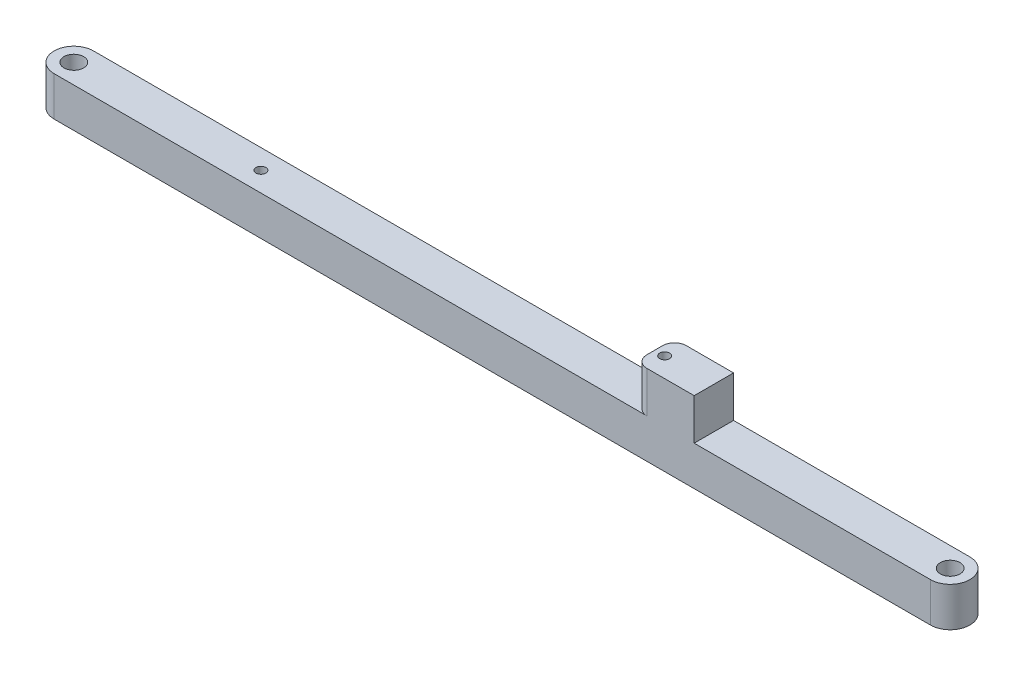
ISO-10303-21;
HEADER;
FILE_DESCRIPTION(('STEP AP214'),'2;1');
FILE_NAME('part.step','',(''),(''),'','','');
FILE_SCHEMA(('AUTOMOTIVE_DESIGN { 1 0 10303 214 1 1 1 1 }'));
ENDSEC;
DATA;
#1=APPLICATION_CONTEXT('core data for automotive mechanical design processes');
#2=APPLICATION_PROTOCOL_DEFINITION('international standard','automotive_design',2000,#1);
#3=PRODUCT_CONTEXT('',#1,'mechanical');
#4=PRODUCT('Part','Part','',(#3));
#5=PRODUCT_RELATED_PRODUCT_CATEGORY('part','',(#4));
#6=PRODUCT_DEFINITION_FORMATION('','',#4);
#7=PRODUCT_DEFINITION_CONTEXT('part definition',#1,'design');
#8=PRODUCT_DEFINITION('design','',#6,#7);
#9=PRODUCT_DEFINITION_SHAPE('','',#8);
#10=(LENGTH_UNIT() NAMED_UNIT(*) SI_UNIT(.MILLI.,.METRE.));
#11=(NAMED_UNIT(*) PLANE_ANGLE_UNIT() SI_UNIT($,.RADIAN.));
#12=(NAMED_UNIT(*) SI_UNIT($,.STERADIAN.) SOLID_ANGLE_UNIT());
#13=UNCERTAINTY_MEASURE_WITH_UNIT(LENGTH_MEASURE(1.E-05),#10,'distance_accuracy_value','');
#14=(GEOMETRIC_REPRESENTATION_CONTEXT(3) GLOBAL_UNCERTAINTY_ASSIGNED_CONTEXT((#13)) GLOBAL_UNIT_ASSIGNED_CONTEXT((#10,
#11,#12)) REPRESENTATION_CONTEXT('',''));
#15=CARTESIAN_POINT('',(0.,0.,0.));
#16=DIRECTION('',(0.,0.,1.));
#17=DIRECTION('',(1.,0.,0.));
#18=AXIS2_PLACEMENT_3D('',#15,#16,#17);
#19=CARTESIAN_POINT('',(0.,25.4,0.));
#20=DIRECTION('',(0.,1.,0.));
#21=DIRECTION('',(0.,0.,1.));
#22=AXIS2_PLACEMENT_3D('',#19,#20,#21);
#23=PLANE('',#22);
#24=DIRECTION('',(0.,0.,1.));
#25=VECTOR('',#24,1.);
#26=CARTESIAN_POINT('',(374.65,25.4,0.));
#27=LINE('',#26,#25);
#28=CARTESIAN_POINT('',(374.65,25.4,-17.78));
#29=VERTEX_POINT('',#28);
#30=CARTESIAN_POINT('',(374.65,25.4,-7.62));
#31=VERTEX_POINT('',#30);
#32=EDGE_CURVE('E150',#29,#31,#27,.T.);
#33=ORIENTED_EDGE('',*,*,#32,.F.);
#34=CARTESIAN_POINT('',(382.27,25.4,-17.78));
#35=DIRECTION('',(0.,1.,0.));
#36=DIRECTION('',(0.,0.,1.));
#37=AXIS2_PLACEMENT_3D('',#34,#35,#36);
#38=CIRCLE('',#37,7.62);
#39=CARTESIAN_POINT('',(382.27,25.4,-25.4));
#40=VERTEX_POINT('',#39);
#41=EDGE_CURVE('E11',#29,#40,#38,.F.);
#42=ORIENTED_EDGE('',*,*,#41,.T.);
#43=DIRECTION('',(1.,0.,0.));
#44=VECTOR('',#43,1.);
#45=CARTESIAN_POINT('',(0.,25.4,-25.4));
#46=LINE('',#45,#44);
#47=CARTESIAN_POINT('',(0.,25.4,-25.4));
#48=VERTEX_POINT('',#47);
#49=EDGE_CURVE('E53',#48,#40,#46,.T.);
#50=ORIENTED_EDGE('',*,*,#49,.F.);
#51=CARTESIAN_POINT('',(0.,25.4,-12.7));
#52=DIRECTION('',(0.,1.,0.));
#53=DIRECTION('',(0.,0.,1.));
#54=AXIS2_PLACEMENT_3D('',#51,#52,#53);
#55=CIRCLE('',#54,12.7);
#56=CARTESIAN_POINT('',(0.,25.4,0.));
#57=VERTEX_POINT('',#56);
#58=EDGE_CURVE('E193',#48,#57,#55,.T.);
#59=ORIENTED_EDGE('',*,*,#58,.T.);
#60=DIRECTION('',(1.,0.,0.));
#61=VECTOR('',#60,1.);
#62=CARTESIAN_POINT('',(0.,25.4,0.));
#63=LINE('',#62,#61);
#64=CARTESIAN_POINT('',(382.27,25.4,0.));
#65=VERTEX_POINT('',#64);
#66=EDGE_CURVE('E171',#57,#65,#63,.T.);
#67=ORIENTED_EDGE('',*,*,#66,.T.);
#68=CARTESIAN_POINT('',(382.27,25.4,-7.62));
#69=DIRECTION('',(0.,1.,0.));
#70=DIRECTION('',(0.,0.,1.));
#71=AXIS2_PLACEMENT_3D('',#68,#69,#70);
#72=CIRCLE('',#71,7.62);
#73=EDGE_CURVE('E46',#65,#31,#72,.F.);
#74=ORIENTED_EDGE('',*,*,#73,.T.);
#75=EDGE_LOOP('',(#33,#42,#50,#59,#67,#74));
#76=FACE_BOUND('',#75,.T.);
#77=CARTESIAN_POINT('',(120.65,25.4,-12.7));
#78=DIRECTION('',(0.,1.,0.));
#79=DIRECTION('',(0.,0.,1.));
#80=AXIS2_PLACEMENT_3D('',#77,#78,#79);
#81=CIRCLE('',#80,3.175);
#82=CARTESIAN_POINT('',(120.65,25.4,-9.525));
#83=VERTEX_POINT('',#82);
#84=EDGE_CURVE('E209',#83,#83,#81,.T.);
#85=ORIENTED_EDGE('',*,*,#84,.F.);
#86=EDGE_LOOP('',(#85));
#87=FACE_BOUND('',#86,.T.);
#88=CARTESIAN_POINT('',(0.,25.4,-12.7));
#89=DIRECTION('',(0.,1.,0.));
#90=DIRECTION('',(0.,0.,1.));
#91=AXIS2_PLACEMENT_3D('',#88,#89,#90);
#92=CIRCLE('',#91,6.35);
#93=CARTESIAN_POINT('',(0.,25.4,-6.35));
#94=VERTEX_POINT('',#93);
#95=EDGE_CURVE('E198',#94,#94,#92,.T.);
#96=ORIENTED_EDGE('',*,*,#95,.F.);
#97=EDGE_LOOP('',(#96));
#98=FACE_BOUND('',#97,.T.);
#99=ADVANCED_FACE('F38',(#76,#87,#98),#23,.T.);
#100=CARTESIAN_POINT('',(0.,25.4,-25.4));
#101=DIRECTION('',(0.,0.,-1.));
#102=DIRECTION('',(-1.,0.,0.));
#103=AXIS2_PLACEMENT_3D('',#100,#101,#102);
#104=PLANE('',#103);
#105=ORIENTED_EDGE('',*,*,#49,.T.);
#106=DIRECTION('',(0.,-1.,0.));
#107=VECTOR('',#106,1.);
#108=CARTESIAN_POINT('',(382.27,51.943,-25.4));
#109=LINE('',#108,#107);
#110=CARTESIAN_POINT('',(382.27,51.943,-25.4));
#111=VERTEX_POINT('',#110);
#112=EDGE_CURVE('E57',#40,#111,#109,.F.);
#113=ORIENTED_EDGE('',*,*,#112,.T.);
#114=DIRECTION('',(-1.,0.,0.));
#115=VECTOR('',#114,1.);
#116=CARTESIAN_POINT('',(374.65,51.943,-25.4));
#117=LINE('',#116,#115);
#118=CARTESIAN_POINT('',(412.75,51.943,-25.4));
#119=VERTEX_POINT('',#118);
#120=EDGE_CURVE('E140',#119,#111,#117,.T.);
#121=ORIENTED_EDGE('',*,*,#120,.F.);
#122=DIRECTION('',(0.,-1.,0.));
#123=VECTOR('',#122,1.);
#124=CARTESIAN_POINT('',(412.75,51.943,-25.4));
#125=LINE('',#124,#123);
#126=CARTESIAN_POINT('',(412.75,25.4,-25.4));
#127=VERTEX_POINT('',#126);
#128=EDGE_CURVE('E136',#119,#127,#125,.T.);
#129=ORIENTED_EDGE('',*,*,#128,.T.);
#130=CARTESIAN_POINT('',(565.15,25.4,-25.4));
#131=VERTEX_POINT('',#130);
#132=EDGE_CURVE('E194',#127,#131,#46,.T.);
#133=ORIENTED_EDGE('',*,*,#132,.T.);
#134=DIRECTION('',(0.,-1.,0.));
#135=VECTOR('',#134,1.);
#136=CARTESIAN_POINT('',(565.15,25.4,-25.4));
#137=LINE('',#136,#135);
#138=CARTESIAN_POINT('',(565.15,0.,-25.4));
#139=VERTEX_POINT('',#138);
#140=EDGE_CURVE('E219',#131,#139,#137,.T.);
#141=ORIENTED_EDGE('',*,*,#140,.T.);
#142=DIRECTION('',(1.,0.,0.));
#143=VECTOR('',#142,1.);
#144=CARTESIAN_POINT('',(0.,0.,-25.4));
#145=LINE('',#144,#143);
#146=CARTESIAN_POINT('',(0.,0.,-25.4));
#147=VERTEX_POINT('',#146);
#148=EDGE_CURVE('E240',#147,#139,#145,.T.);
#149=ORIENTED_EDGE('',*,*,#148,.F.);
#150=DIRECTION('',(0.,-1.,0.));
#151=VECTOR('',#150,1.);
#152=CARTESIAN_POINT('',(0.,25.4,-25.4));
#153=LINE('',#152,#151);
#154=EDGE_CURVE('E179',#48,#147,#153,.T.);
#155=ORIENTED_EDGE('',*,*,#154,.F.);
#156=EDGE_LOOP('',(#105,#113,#121,#129,#133,#141,#149,#155));
#157=FACE_BOUND('',#156,.T.);
#158=ADVANCED_FACE('F250',(#157),#104,.T.);
#159=CARTESIAN_POINT('',(0.,25.4,-12.7));
#160=DIRECTION('',(0.,-1.,0.));
#161=DIRECTION('',(0.,0.,-1.));
#162=AXIS2_PLACEMENT_3D('',#159,#160,#161);
#163=CYLINDRICAL_SURFACE('',#162,12.7);
#164=CARTESIAN_POINT('',(0.,0.,-12.7));
#165=DIRECTION('',(0.,1.,0.));
#166=DIRECTION('',(0.,0.,1.));
#167=AXIS2_PLACEMENT_3D('',#164,#165,#166);
#168=CIRCLE('',#167,12.7);
#169=CARTESIAN_POINT('',(0.,0.,0.));
#170=VERTEX_POINT('',#169);
#171=EDGE_CURVE('E238',#147,#170,#168,.T.);
#172=ORIENTED_EDGE('',*,*,#171,.T.);
#173=DIRECTION('',(0.,-1.,0.));
#174=VECTOR('',#173,1.);
#175=CARTESIAN_POINT('',(0.,25.4,0.));
#176=LINE('',#175,#174);
#177=EDGE_CURVE('E180',#57,#170,#176,.T.);
#178=ORIENTED_EDGE('',*,*,#177,.F.);
#179=ORIENTED_EDGE('',*,*,#58,.F.);
#180=ORIENTED_EDGE('',*,*,#154,.T.);
#181=EDGE_LOOP('',(#172,#178,#179,#180));
#182=FACE_BOUND('',#181,.T.);
#183=ADVANCED_FACE('F300',(#182),#163,.T.);
#184=CARTESIAN_POINT('',(0.,25.4,0.));
#185=DIRECTION('',(0.,0.,-1.));
#186=DIRECTION('',(-1.,0.,0.));
#187=AXIS2_PLACEMENT_3D('',#184,#185,#186);
#188=PLANE('',#187);
#189=DIRECTION('',(1.,0.,0.));
#190=VECTOR('',#189,1.);
#191=CARTESIAN_POINT('',(374.65,51.943,0.));
#192=LINE('',#191,#190);
#193=CARTESIAN_POINT('',(382.27,51.943,0.));
#194=VERTEX_POINT('',#193);
#195=CARTESIAN_POINT('',(412.75,51.943,0.));
#196=VERTEX_POINT('',#195);
#197=EDGE_CURVE('E113',#194,#196,#192,.T.);
#198=ORIENTED_EDGE('',*,*,#197,.F.);
#199=DIRECTION('',(0.,-1.,0.));
#200=VECTOR('',#199,1.);
#201=CARTESIAN_POINT('',(382.27,25.4,0.));
#202=LINE('',#201,#200);
#203=EDGE_CURVE('E156',#194,#65,#202,.T.);
#204=ORIENTED_EDGE('',*,*,#203,.T.);
#205=ORIENTED_EDGE('',*,*,#66,.F.);
#206=ORIENTED_EDGE('',*,*,#177,.T.);
#207=DIRECTION('',(1.,0.,0.));
#208=VECTOR('',#207,1.);
#209=CARTESIAN_POINT('',(0.,0.,0.));
#210=LINE('',#209,#208);
#211=CARTESIAN_POINT('',(565.15,0.,0.));
#212=VERTEX_POINT('',#211);
#213=EDGE_CURVE('E215',#170,#212,#210,.T.);
#214=ORIENTED_EDGE('',*,*,#213,.T.);
#215=DIRECTION('',(0.,-1.,0.));
#216=VECTOR('',#215,1.);
#217=CARTESIAN_POINT('',(565.15,25.4,0.));
#218=LINE('',#217,#216);
#219=CARTESIAN_POINT('',(565.15,25.4,0.));
#220=VERTEX_POINT('',#219);
#221=EDGE_CURVE('E187',#220,#212,#218,.T.);
#222=ORIENTED_EDGE('',*,*,#221,.F.);
#223=CARTESIAN_POINT('',(412.75,25.4,0.));
#224=VERTEX_POINT('',#223);
#225=EDGE_CURVE('E132',#224,#220,#63,.T.);
#226=ORIENTED_EDGE('',*,*,#225,.F.);
#227=DIRECTION('',(0.,-1.,0.));
#228=VECTOR('',#227,1.);
#229=CARTESIAN_POINT('',(412.75,51.943,0.));
#230=LINE('',#229,#228);
#231=EDGE_CURVE('E129',#196,#224,#230,.T.);
#232=ORIENTED_EDGE('',*,*,#231,.F.);
#233=EDGE_LOOP('',(#198,#204,#205,#206,#214,#222,#226,#232));
#234=FACE_BOUND('',#233,.T.);
#235=ADVANCED_FACE('F130',(#234),#188,.F.);
#236=CARTESIAN_POINT('',(120.65,25.4,-12.7));
#237=DIRECTION('',(0.,-1.,0.));
#238=DIRECTION('',(0.,0.,-1.));
#239=AXIS2_PLACEMENT_3D('',#236,#237,#238);
#240=CYLINDRICAL_SURFACE('',#239,3.175);
#241=ORIENTED_EDGE('',*,*,#84,.T.);
#242=EDGE_LOOP('',(#241));
#243=FACE_BOUND('',#242,.T.);
#244=CARTESIAN_POINT('',(120.65,0.,-12.7));
#245=DIRECTION('',(0.,1.,0.));
#246=DIRECTION('',(0.,0.,1.));
#247=AXIS2_PLACEMENT_3D('',#244,#245,#246);
#248=CIRCLE('',#247,3.175);
#249=CARTESIAN_POINT('',(120.65,0.,-9.525));
#250=VERTEX_POINT('',#249);
#251=EDGE_CURVE('E233',#250,#250,#248,.T.);
#252=ORIENTED_EDGE('',*,*,#251,.F.);
#253=EDGE_LOOP('',(#252));
#254=FACE_BOUND('',#253,.T.);
#255=ADVANCED_FACE('F246',(#243,#254),#240,.F.);
#256=CARTESIAN_POINT('',(565.15,25.4,-12.7));
#257=DIRECTION('',(0.,-1.,0.));
#258=DIRECTION('',(0.,0.,-1.));
#259=AXIS2_PLACEMENT_3D('',#256,#257,#258);
#260=CYLINDRICAL_SURFACE('',#259,12.7);
#261=CARTESIAN_POINT('',(565.15,0.,-12.7));
#262=DIRECTION('',(0.,1.,0.));
#263=DIRECTION('',(0.,0.,1.));
#264=AXIS2_PLACEMENT_3D('',#261,#262,#263);
#265=CIRCLE('',#264,12.7);
#266=EDGE_CURVE('E222',#139,#212,#265,.F.);
#267=ORIENTED_EDGE('',*,*,#266,.F.);
#268=ORIENTED_EDGE('',*,*,#140,.F.);
#269=CARTESIAN_POINT('',(565.15,25.4,-12.7));
#270=DIRECTION('',(0.,1.,0.));
#271=DIRECTION('',(0.,0.,1.));
#272=AXIS2_PLACEMENT_3D('',#269,#270,#271);
#273=CIRCLE('',#272,12.7);
#274=EDGE_CURVE('E203',#131,#220,#273,.F.);
#275=ORIENTED_EDGE('',*,*,#274,.T.);
#276=ORIENTED_EDGE('',*,*,#221,.T.);
#277=EDGE_LOOP('',(#267,#268,#275,#276));
#278=FACE_BOUND('',#277,.T.);
#279=ADVANCED_FACE('F221',(#278),#260,.T.);
#280=CARTESIAN_POINT('',(0.,25.4,-12.7));
#281=DIRECTION('',(0.,-1.,0.));
#282=DIRECTION('',(0.,0.,-1.));
#283=AXIS2_PLACEMENT_3D('',#280,#281,#282);
#284=CYLINDRICAL_SURFACE('',#283,6.35);
#285=ORIENTED_EDGE('',*,*,#95,.T.);
#286=EDGE_LOOP('',(#285));
#287=FACE_BOUND('',#286,.T.);
#288=CARTESIAN_POINT('',(0.,0.,-12.7));
#289=DIRECTION('',(0.,1.,0.));
#290=DIRECTION('',(0.,0.,1.));
#291=AXIS2_PLACEMENT_3D('',#288,#289,#290);
#292=CIRCLE('',#291,6.35);
#293=CARTESIAN_POINT('',(0.,0.,-6.35));
#294=VERTEX_POINT('',#293);
#295=EDGE_CURVE('E135',#294,#294,#292,.T.);
#296=ORIENTED_EDGE('',*,*,#295,.F.);
#297=EDGE_LOOP('',(#296));
#298=FACE_BOUND('',#297,.T.);
#299=ADVANCED_FACE('F292',(#287,#298),#284,.F.);
#300=CARTESIAN_POINT('',(565.15,25.4,-12.7));
#301=DIRECTION('',(0.,-1.,0.));
#302=DIRECTION('',(0.,0.,-1.));
#303=AXIS2_PLACEMENT_3D('',#300,#301,#302);
#304=CYLINDRICAL_SURFACE('',#303,6.34999999999994);
#305=CARTESIAN_POINT('',(565.15,25.4,-12.7));
#306=DIRECTION('',(0.,1.,0.));
#307=DIRECTION('',(0.,0.,1.));
#308=AXIS2_PLACEMENT_3D('',#305,#306,#307);
#309=CIRCLE('',#308,6.34999999999994);
#310=CARTESIAN_POINT('',(565.15,25.4,-6.35000000000006));
#311=VERTEX_POINT('',#310);
#312=EDGE_CURVE('E225',#311,#311,#309,.T.);
#313=ORIENTED_EDGE('',*,*,#312,.T.);
#314=EDGE_LOOP('',(#313));
#315=FACE_BOUND('',#314,.T.);
#316=CARTESIAN_POINT('',(565.15,0.,-12.7));
#317=DIRECTION('',(0.,1.,0.));
#318=DIRECTION('',(0.,0.,1.));
#319=AXIS2_PLACEMENT_3D('',#316,#317,#318);
#320=CIRCLE('',#319,6.34999999999994);
#321=CARTESIAN_POINT('',(565.15,0.,-6.35000000000006));
#322=VERTEX_POINT('',#321);
#323=EDGE_CURVE('E230',#322,#322,#320,.T.);
#324=ORIENTED_EDGE('',*,*,#323,.F.);
#325=EDGE_LOOP('',(#324));
#326=FACE_BOUND('',#325,.T.);
#327=ADVANCED_FACE('F286',(#315,#326),#304,.F.);
#328=DIRECTION('',(0.,0.,-1.));
#329=VECTOR('',#328,1.);
#330=CARTESIAN_POINT('',(412.75,25.4,0.));
#331=LINE('',#330,#329);
#332=EDGE_CURVE('E154',#224,#127,#331,.T.);
#333=ORIENTED_EDGE('',*,*,#332,.F.);
#334=ORIENTED_EDGE('',*,*,#225,.T.);
#335=ORIENTED_EDGE('',*,*,#274,.F.);
#336=ORIENTED_EDGE('',*,*,#132,.F.);
#337=EDGE_LOOP('',(#333,#334,#335,#336));
#338=FACE_BOUND('',#337,.T.);
#339=ORIENTED_EDGE('',*,*,#312,.F.);
#340=EDGE_LOOP('',(#339));
#341=FACE_BOUND('',#340,.T.);
#342=ADVANCED_FACE('F212',(#338,#341),#23,.T.);
#343=CARTESIAN_POINT('',(0.,0.,0.));
#344=DIRECTION('',(0.,1.,0.));
#345=DIRECTION('',(0.,0.,1.));
#346=AXIS2_PLACEMENT_3D('',#343,#344,#345);
#347=PLANE('',#346);
#348=ORIENTED_EDGE('',*,*,#295,.T.);
#349=EDGE_LOOP('',(#348));
#350=FACE_BOUND('',#349,.T.);
#351=ORIENTED_EDGE('',*,*,#148,.T.);
#352=ORIENTED_EDGE('',*,*,#266,.T.);
#353=ORIENTED_EDGE('',*,*,#213,.F.);
#354=ORIENTED_EDGE('',*,*,#171,.F.);
#355=EDGE_LOOP('',(#351,#352,#353,#354));
#356=FACE_BOUND('',#355,.T.);
#357=ORIENTED_EDGE('',*,*,#251,.T.);
#358=EDGE_LOOP('',(#357));
#359=FACE_BOUND('',#358,.T.);
#360=ORIENTED_EDGE('',*,*,#323,.T.);
#361=EDGE_LOOP('',(#360));
#362=FACE_BOUND('',#361,.T.);
#363=ADVANCED_FACE('F283',(#350,#356,#359,#362),#347,.F.);
#364=CARTESIAN_POINT('',(374.65,51.943,0.));
#365=DIRECTION('',(1.,0.,0.));
#366=DIRECTION('',(0.,0.,-1.));
#367=AXIS2_PLACEMENT_3D('',#364,#365,#366);
#368=PLANE('',#367);
#369=ORIENTED_EDGE('',*,*,#32,.T.);
#370=DIRECTION('',(0.,-1.,0.));
#371=VECTOR('',#370,1.);
#372=CARTESIAN_POINT('',(374.65,51.943,-7.62));
#373=LINE('',#372,#371);
#374=CARTESIAN_POINT('',(374.65,51.943,-7.62));
#375=VERTEX_POINT('',#374);
#376=EDGE_CURVE('E161',#31,#375,#373,.F.);
#377=ORIENTED_EDGE('',*,*,#376,.T.);
#378=DIRECTION('',(0.,0.,1.));
#379=VECTOR('',#378,1.);
#380=CARTESIAN_POINT('',(374.65,51.943,0.));
#381=LINE('',#380,#379);
#382=CARTESIAN_POINT('',(374.65,51.943,-17.78));
#383=VERTEX_POINT('',#382);
#384=EDGE_CURVE('E125',#383,#375,#381,.T.);
#385=ORIENTED_EDGE('',*,*,#384,.F.);
#386=DIRECTION('',(0.,-1.,0.));
#387=VECTOR('',#386,1.);
#388=CARTESIAN_POINT('',(374.65,25.4,-17.78));
#389=LINE('',#388,#387);
#390=EDGE_CURVE('E158',#383,#29,#389,.T.);
#391=ORIENTED_EDGE('',*,*,#390,.T.);
#392=EDGE_LOOP('',(#369,#377,#385,#391));
#393=FACE_BOUND('',#392,.T.);
#394=ADVANCED_FACE('F175',(#393),#368,.F.);
#395=CARTESIAN_POINT('',(412.75,51.943,0.));
#396=DIRECTION('',(-1.,0.,0.));
#397=DIRECTION('',(0.,0.,1.));
#398=AXIS2_PLACEMENT_3D('',#395,#396,#397);
#399=PLANE('',#398);
#400=ORIENTED_EDGE('',*,*,#332,.T.);
#401=ORIENTED_EDGE('',*,*,#128,.F.);
#402=DIRECTION('',(0.,0.,-1.));
#403=VECTOR('',#402,1.);
#404=CARTESIAN_POINT('',(412.75,51.943,0.));
#405=LINE('',#404,#403);
#406=EDGE_CURVE('E118',#196,#119,#405,.T.);
#407=ORIENTED_EDGE('',*,*,#406,.F.);
#408=ORIENTED_EDGE('',*,*,#231,.T.);
#409=EDGE_LOOP('',(#400,#401,#407,#408));
#410=FACE_BOUND('',#409,.T.);
#411=ADVANCED_FACE('F138',(#410),#399,.F.);
#412=CARTESIAN_POINT('',(0.,51.943,0.));
#413=DIRECTION('',(0.,-1.,0.));
#414=DIRECTION('',(0.,0.,-1.));
#415=AXIS2_PLACEMENT_3D('',#412,#413,#414);
#416=PLANE('',#415);
#417=CARTESIAN_POINT('',(381.,51.943,-12.7));
#418=DIRECTION('',(0.,1.,0.));
#419=DIRECTION('',(0.,0.,1.));
#420=AXIS2_PLACEMENT_3D('',#417,#418,#419);
#421=CIRCLE('',#420,3.17499999999997);
#422=CARTESIAN_POINT('',(381.,51.943,-9.52500000000002));
#423=VERTEX_POINT('',#422);
#424=EDGE_CURVE('E260',#423,#423,#421,.T.);
#425=ORIENTED_EDGE('',*,*,#424,.F.);
#426=EDGE_LOOP('',(#425));
#427=FACE_BOUND('',#426,.T.);
#428=ORIENTED_EDGE('',*,*,#384,.T.);
#429=CARTESIAN_POINT('',(382.27,51.943,-7.62));
#430=DIRECTION('',(0.,-1.,0.));
#431=DIRECTION('',(0.,0.,-1.));
#432=AXIS2_PLACEMENT_3D('',#429,#430,#431);
#433=CIRCLE('',#432,7.62);
#434=EDGE_CURVE('E121',#375,#194,#433,.F.);
#435=ORIENTED_EDGE('',*,*,#434,.T.);
#436=ORIENTED_EDGE('',*,*,#197,.T.);
#437=ORIENTED_EDGE('',*,*,#406,.T.);
#438=ORIENTED_EDGE('',*,*,#120,.T.);
#439=CARTESIAN_POINT('',(382.27,51.943,-17.78));
#440=DIRECTION('',(0.,-1.,0.));
#441=DIRECTION('',(0.,0.,-1.));
#442=AXIS2_PLACEMENT_3D('',#439,#440,#441);
#443=CIRCLE('',#442,7.62);
#444=EDGE_CURVE('E163',#111,#383,#443,.F.);
#445=ORIENTED_EDGE('',*,*,#444,.T.);
#446=EDGE_LOOP('',(#428,#435,#436,#437,#438,#445));
#447=FACE_BOUND('',#446,.T.);
#448=ADVANCED_FACE('F116',(#427,#447),#416,.F.);
#449=CARTESIAN_POINT('',(381.,32.893,-12.7));
#450=DIRECTION('',(0.,1.,0.));
#451=DIRECTION('',(0.,0.,1.));
#452=AXIS2_PLACEMENT_3D('',#449,#450,#451);
#453=CYLINDRICAL_SURFACE('',#452,3.17499999999997);
#454=CARTESIAN_POINT('',(381.,32.893,-12.7));
#455=DIRECTION('',(0.,1.,0.));
#456=DIRECTION('',(0.,0.,1.));
#457=AXIS2_PLACEMENT_3D('',#454,#455,#456);
#458=CIRCLE('',#457,3.17499999999997);
#459=CARTESIAN_POINT('',(381.,32.893,-9.52500000000002));
#460=VERTEX_POINT('',#459);
#461=EDGE_CURVE('E155',#460,#460,#458,.T.);
#462=CARTESIAN_POINT('',(381.,32.893,-9.52500000000002));
#463=CARTESIAN_POINT('',(381.,33.0914375,-9.52500000000002));
#464=CARTESIAN_POINT('',(381.,33.289875,-9.52500000000002));
#465=CARTESIAN_POINT('',(381.,33.68675,-9.52500000000002));
#466=CARTESIAN_POINT('',(381.,33.8851875,-9.52500000000002));
#467=CARTESIAN_POINT('',(381.,34.2820625,-9.52500000000002));
#468=CARTESIAN_POINT('',(381.,34.4805,-9.52500000000002));
#469=CARTESIAN_POINT('',(381.,34.877375,-9.52500000000002));
#470=CARTESIAN_POINT('',(381.,35.0758125,-9.52500000000002));
#471=CARTESIAN_POINT('',(381.,35.4726875,-9.52500000000002));
#472=CARTESIAN_POINT('',(381.,35.671125,-9.52500000000002));
#473=CARTESIAN_POINT('',(381.,36.068,-9.52500000000002));
#474=CARTESIAN_POINT('',(381.,36.2664375,-9.52500000000002));
#475=CARTESIAN_POINT('',(381.,36.6633125,-9.52500000000002));
#476=CARTESIAN_POINT('',(381.,36.86175,-9.52500000000002));
#477=CARTESIAN_POINT('',(381.,37.258625,-9.52500000000002));
#478=CARTESIAN_POINT('',(381.,37.4570625,-9.52500000000002));
#479=CARTESIAN_POINT('',(381.,37.8539375,-9.52500000000002));
#480=CARTESIAN_POINT('',(381.,38.052375,-9.52500000000002));
#481=CARTESIAN_POINT('',(381.,38.44925,-9.52500000000002));
#482=CARTESIAN_POINT('',(381.,38.6476875,-9.52500000000002));
#483=CARTESIAN_POINT('',(381.,39.0445625,-9.52500000000002));
#484=CARTESIAN_POINT('',(381.,39.243,-9.52500000000002));
#485=CARTESIAN_POINT('',(381.,39.639875,-9.52500000000002));
#486=CARTESIAN_POINT('',(381.,39.8383125,-9.52500000000002));
#487=CARTESIAN_POINT('',(381.,40.2351875,-9.52500000000002));
#488=CARTESIAN_POINT('',(381.,40.433625,-9.52500000000002));
#489=CARTESIAN_POINT('',(381.,40.8305,-9.52500000000002));
#490=CARTESIAN_POINT('',(381.,41.0289375,-9.52500000000002));
#491=CARTESIAN_POINT('',(381.,41.4258125,-9.52500000000002));
#492=CARTESIAN_POINT('',(381.,41.62425,-9.52500000000002));
#493=CARTESIAN_POINT('',(381.,42.021125,-9.52500000000002));
#494=CARTESIAN_POINT('',(381.,42.2195625,-9.52500000000002));
#495=CARTESIAN_POINT('',(381.,42.6164375,-9.52500000000002));
#496=CARTESIAN_POINT('',(381.,42.814875,-9.52500000000002));
#497=CARTESIAN_POINT('',(381.,43.21175,-9.52500000000002));
#498=CARTESIAN_POINT('',(381.,43.4101875,-9.52500000000002));
#499=CARTESIAN_POINT('',(381.,43.8070625,-9.52500000000002));
#500=CARTESIAN_POINT('',(381.,44.0055,-9.52500000000002));
#501=CARTESIAN_POINT('',(381.,44.402375,-9.52500000000002));
#502=CARTESIAN_POINT('',(381.,44.6008125,-9.52500000000002));
#503=CARTESIAN_POINT('',(381.,44.9976875,-9.52500000000002));
#504=CARTESIAN_POINT('',(381.,45.196125,-9.52500000000002));
#505=CARTESIAN_POINT('',(381.,45.593,-9.52500000000002));
#506=CARTESIAN_POINT('',(381.,45.7914375,-9.52500000000002));
#507=CARTESIAN_POINT('',(381.,46.1883125,-9.52500000000002));
#508=CARTESIAN_POINT('',(381.,46.38675,-9.52500000000002));
#509=CARTESIAN_POINT('',(381.,46.783625,-9.52500000000002));
#510=CARTESIAN_POINT('',(381.,46.9820625,-9.52500000000002));
#511=CARTESIAN_POINT('',(381.,47.3789375,-9.52500000000002));
#512=CARTESIAN_POINT('',(381.,47.577375,-9.52500000000002));
#513=CARTESIAN_POINT('',(381.,47.97425,-9.52500000000002));
#514=CARTESIAN_POINT('',(381.,48.1726875,-9.52500000000002));
#515=CARTESIAN_POINT('',(381.,48.5695625,-9.52500000000002));
#516=CARTESIAN_POINT('',(381.,48.768,-9.52500000000002));
#517=CARTESIAN_POINT('',(381.,49.164875,-9.52500000000002));
#518=CARTESIAN_POINT('',(381.,49.3633125,-9.52500000000002));
#519=CARTESIAN_POINT('',(381.,49.7601875,-9.52500000000002));
#520=CARTESIAN_POINT('',(381.,49.958625,-9.52500000000002));
#521=CARTESIAN_POINT('',(381.,50.3555,-9.52500000000002));
#522=CARTESIAN_POINT('',(381.,50.5539375,-9.52500000000002));
#523=CARTESIAN_POINT('',(381.,50.9508125,-9.52500000000002));
#524=CARTESIAN_POINT('',(381.,51.14925,-9.52500000000002));
#525=CARTESIAN_POINT('',(381.,51.546125,-9.52500000000002));
#526=CARTESIAN_POINT('',(381.,51.7445625,-9.52500000000002));
#527=CARTESIAN_POINT('',(381.,51.943,-9.52500000000002));
#528=B_SPLINE_CURVE_WITH_KNOTS('',3,(#462,#463,#464,#465,#466,#467,#468,#469,#470,#471,#472,
#473,#474,#475,#476,#477,#478,#479,#480,#481,#482,#483,#484,#485,#486,#487,#488,#489,#490,#491,
#492,#493,#494,#495,#496,#497,#498,#499,#500,#501,#502,#503,#504,#505,#506,#507,#508,#509,#510,
#511,#512,#513,#514,#515,#516,#517,#518,#519,#520,#521,#522,#523,#524,#525,#526,#527),
.UNSPECIFIED.,.F.,.F.,(4,2,2,2,2,2,2,2,2,2,2,2,2,2,2,2,2,2,2,2,2,2,2,2,2,2,2,2,2,2,2,2,4),(0.,
0.5953125,1.190625,1.7859375,2.38125,2.9765625,3.571875,4.1671875,4.7625,5.3578125,5.953125,
6.5484375,7.14375,7.7390625,8.334375,8.92968750000001,9.52500000000001,10.1203125,10.715625,
11.3109375,11.90625,12.5015625,13.096875,13.6921875,14.2875,14.8828125,15.478125,16.0734375,
16.66875,17.2640625,17.859375,18.4546875,19.05),.UNSPECIFIED.);
#529=EDGE_CURVE('BSEAM268',#460,#423,#528,.T.);
#530=ORIENTED_EDGE('',*,*,#461,.F.);
#531=ORIENTED_EDGE('',*,*,#424,.T.);
#532=ORIENTED_EDGE('',*,*,#529,.T.);
#533=ORIENTED_EDGE('',*,*,#529,.F.);
#534=EDGE_LOOP('',(#530,#532,#531,#533));
#535=FACE_BOUND('',#534,.T.);
#536=ADVANCED_FACE('F268',(#535),#453,.F.);
#537=CARTESIAN_POINT('',(381.,32.893,-12.7));
#538=DIRECTION('',(0.,1.,0.));
#539=DIRECTION('',(0.,0.,1.));
#540=AXIS2_PLACEMENT_3D('',#537,#538,#539);
#541=PLANE('',#540);
#542=ORIENTED_EDGE('',*,*,#461,.T.);
#543=EDGE_LOOP('',(#542));
#544=FACE_BOUND('',#543,.T.);
#545=ADVANCED_FACE('F266',(#544),#541,.T.);
#546=CARTESIAN_POINT('',(382.27,25.4,-7.62));
#547=DIRECTION('',(0.,-1.,0.));
#548=DIRECTION('',(0.,0.,-1.));
#549=AXIS2_PLACEMENT_3D('',#546,#547,#548);
#550=CYLINDRICAL_SURFACE('',#549,7.62);
#551=ORIENTED_EDGE('',*,*,#434,.F.);
#552=ORIENTED_EDGE('',*,*,#376,.F.);
#553=ORIENTED_EDGE('',*,*,#73,.F.);
#554=ORIENTED_EDGE('',*,*,#203,.F.);
#555=EDGE_LOOP('',(#551,#552,#553,#554));
#556=FACE_BOUND('',#555,.T.);
#557=ADVANCED_FACE('F178',(#556),#550,.T.);
#558=CARTESIAN_POINT('',(382.27,51.943,-17.78));
#559=DIRECTION('',(0.,1.,0.));
#560=DIRECTION('',(0.,0.,1.));
#561=AXIS2_PLACEMENT_3D('',#558,#559,#560);
#562=CYLINDRICAL_SURFACE('',#561,7.62);
#563=ORIENTED_EDGE('',*,*,#444,.F.);
#564=ORIENTED_EDGE('',*,*,#112,.F.);
#565=ORIENTED_EDGE('',*,*,#41,.F.);
#566=ORIENTED_EDGE('',*,*,#390,.F.);
#567=EDGE_LOOP('',(#563,#564,#565,#566));
#568=FACE_BOUND('',#567,.T.);
#569=ADVANCED_FACE('F40',(#568),#562,.T.);
#570=CLOSED_SHELL('',(#99,#158,#183,#235,#255,#279,#299,#327,#342,#363,#394,#411,#448,#536,#545,
#557,#569));
#571=MANIFOLD_SOLID_BREP('B2',#570);
#572=ADVANCED_BREP_SHAPE_REPRESENTATION('',(#18,#571),#14);
#573=SHAPE_DEFINITION_REPRESENTATION(#9,#572);
ENDSEC;
END-ISO-10303-21;
